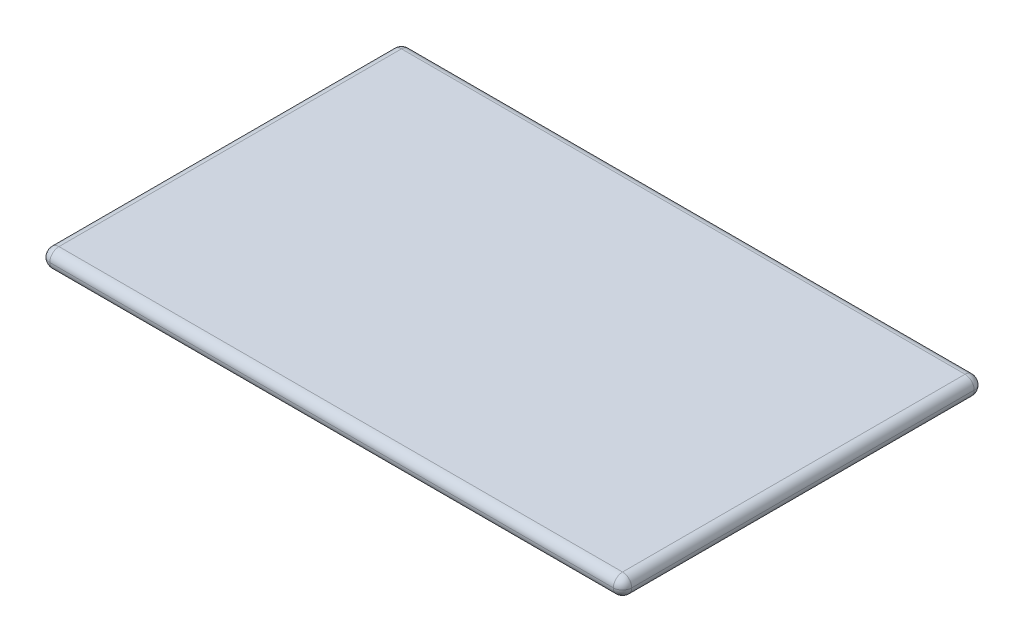
ISO-10303-21;
HEADER;
FILE_DESCRIPTION(('STEP AP214'),'2;1');
FILE_NAME('part.step','',(''),(''),'','','');
FILE_SCHEMA(('AUTOMOTIVE_DESIGN { 1 0 10303 214 1 1 1 1 }'));
ENDSEC;
DATA;
#1=APPLICATION_CONTEXT('core data for automotive mechanical design processes');
#2=APPLICATION_PROTOCOL_DEFINITION('international standard','automotive_design',2000,#1);
#3=PRODUCT_CONTEXT('',#1,'mechanical');
#4=PRODUCT('Part','Part','',(#3));
#5=PRODUCT_RELATED_PRODUCT_CATEGORY('part','',(#4));
#6=PRODUCT_DEFINITION_FORMATION('','',#4);
#7=PRODUCT_DEFINITION_CONTEXT('part definition',#1,'design');
#8=PRODUCT_DEFINITION('design','',#6,#7);
#9=PRODUCT_DEFINITION_SHAPE('','',#8);
#10=(LENGTH_UNIT() NAMED_UNIT(*) SI_UNIT(.MILLI.,.METRE.));
#11=(NAMED_UNIT(*) PLANE_ANGLE_UNIT() SI_UNIT($,.RADIAN.));
#12=(NAMED_UNIT(*) SI_UNIT($,.STERADIAN.) SOLID_ANGLE_UNIT());
#13=UNCERTAINTY_MEASURE_WITH_UNIT(LENGTH_MEASURE(1.E-05),#10,'distance_accuracy_value','');
#14=(GEOMETRIC_REPRESENTATION_CONTEXT(3) GLOBAL_UNCERTAINTY_ASSIGNED_CONTEXT((#13)) GLOBAL_UNIT_ASSIGNED_CONTEXT((#10,
#11,#12)) REPRESENTATION_CONTEXT('',''));
#15=CARTESIAN_POINT('',(0.,0.,0.));
#16=DIRECTION('',(0.,0.,1.));
#17=DIRECTION('',(1.,0.,0.));
#18=AXIS2_PLACEMENT_3D('',#15,#16,#17);
#19=CARTESIAN_POINT('',(0.,0.2032,4.0005));
#20=DIRECTION('',(0.,1.,0.));
#21=DIRECTION('',(-1.,0.,0.));
#22=AXIS2_PLACEMENT_3D('',#19,#20,#21);
#23=PLANE('',#22);
#24=DIRECTION('',(0.,0.,-1.));
#25=VECTOR('',#24,1.);
#26=CARTESIAN_POINT('',(6.2484,0.2032,4.0005));
#27=LINE('',#26,#25);
#28=CARTESIAN_POINT('',(6.2484,0.2032,3.7973));
#29=VERTEX_POINT('',#28);
#30=CARTESIAN_POINT('',(6.2484,0.2032,-3.7973));
#31=VERTEX_POINT('',#30);
#32=EDGE_CURVE('E45',#29,#31,#27,.T.);
#33=ORIENTED_EDGE('',*,*,#32,.T.);
#34=DIRECTION('',(1.,0.,0.));
#35=VECTOR('',#34,1.);
#36=CARTESIAN_POINT('',(-6.4516,0.2032,-3.7973));
#37=LINE('',#36,#35);
#38=CARTESIAN_POINT('',(-6.2484,0.2032,-3.7973));
#39=VERTEX_POINT('',#38);
#40=EDGE_CURVE('E11',#31,#39,#37,.F.);
#41=ORIENTED_EDGE('',*,*,#40,.T.);
#42=DIRECTION('',(0.,0.,-1.));
#43=VECTOR('',#42,1.);
#44=CARTESIAN_POINT('',(-6.2484,0.2032,4.0005));
#45=LINE('',#44,#43);
#46=CARTESIAN_POINT('',(-6.2484,0.2032,3.7973));
#47=VERTEX_POINT('',#46);
#48=EDGE_CURVE('E117',#39,#47,#45,.F.);
#49=ORIENTED_EDGE('',*,*,#48,.T.);
#50=DIRECTION('',(1.,0.,0.));
#51=VECTOR('',#50,1.);
#52=CARTESIAN_POINT('',(0.,0.2032,3.7973));
#53=LINE('',#52,#51);
#54=EDGE_CURVE('E115',#47,#29,#53,.T.);
#55=ORIENTED_EDGE('',*,*,#54,.T.);
#56=EDGE_LOOP('',(#33,#41,#49,#55));
#57=FACE_BOUND('',#56,.T.);
#58=ADVANCED_FACE('F35',(#57),#23,.T.);
#59=CARTESIAN_POINT('',(0.,-0.2032,4.0005));
#60=DIRECTION('',(0.,1.,0.));
#61=DIRECTION('',(0.,0.,1.));
#62=AXIS2_PLACEMENT_3D('',#59,#60,#61);
#63=PLANE('',#62);
#64=DIRECTION('',(0.,0.,-1.));
#65=VECTOR('',#64,1.);
#66=CARTESIAN_POINT('',(-6.2484,-0.2032,4.0005));
#67=LINE('',#66,#65);
#68=CARTESIAN_POINT('',(-6.2484,-0.2032,3.7973));
#69=VERTEX_POINT('',#68);
#70=CARTESIAN_POINT('',(-6.2484,-0.2032,-3.7973));
#71=VERTEX_POINT('',#70);
#72=EDGE_CURVE('E190',#69,#71,#67,.T.);
#73=ORIENTED_EDGE('',*,*,#72,.T.);
#74=DIRECTION('',(1.,0.,0.));
#75=VECTOR('',#74,1.);
#76=CARTESIAN_POINT('',(0.,-0.2032,-3.7973));
#77=LINE('',#76,#75);
#78=CARTESIAN_POINT('',(6.2484,-0.2032,-3.7973));
#79=VERTEX_POINT('',#78);
#80=EDGE_CURVE('E121',#71,#79,#77,.T.);
#81=ORIENTED_EDGE('',*,*,#80,.T.);
#82=DIRECTION('',(0.,0.,-1.));
#83=VECTOR('',#82,1.);
#84=CARTESIAN_POINT('',(6.2484,-0.2032,4.0005));
#85=LINE('',#84,#83);
#86=CARTESIAN_POINT('',(6.2484,-0.2032,3.7973));
#87=VERTEX_POINT('',#86);
#88=EDGE_CURVE('E196',#79,#87,#85,.F.);
#89=ORIENTED_EDGE('',*,*,#88,.T.);
#90=DIRECTION('',(1.,0.,0.));
#91=VECTOR('',#90,1.);
#92=CARTESIAN_POINT('',(-6.4516,-0.2032,3.7973));
#93=LINE('',#92,#91);
#94=EDGE_CURVE('E187',#87,#69,#93,.F.);
#95=ORIENTED_EDGE('',*,*,#94,.T.);
#96=EDGE_LOOP('',(#73,#81,#89,#95));
#97=FACE_BOUND('',#96,.T.);
#98=ADVANCED_FACE('F202',(#97),#63,.F.);
#99=CARTESIAN_POINT('',(-6.2484,0.,4.0005));
#100=DIRECTION('',(0.,0.,1.));
#101=DIRECTION('',(1.,0.,0.));
#102=AXIS2_PLACEMENT_3D('',#99,#100,#101);
#103=CYLINDRICAL_SURFACE('',#102,0.2032);
#104=DIRECTION('',(0.,0.,-1.));
#105=VECTOR('',#104,1.);
#106=CARTESIAN_POINT('',(-6.4516,0.,-4.0005));
#107=LINE('',#106,#105);
#108=CARTESIAN_POINT('',(-6.4516,0.,3.7973));
#109=VERTEX_POINT('',#108);
#110=CARTESIAN_POINT('',(-6.4516,0.,-3.7973));
#111=VERTEX_POINT('',#110);
#112=EDGE_CURVE('E180',#109,#111,#107,.T.);
#113=ORIENTED_EDGE('',*,*,#112,.F.);
#114=CARTESIAN_POINT('',(-6.2484,0.,3.7973));
#115=DIRECTION('',(0.,0.,1.));
#116=DIRECTION('',(1.,0.,0.));
#117=AXIS2_PLACEMENT_3D('',#114,#115,#116);
#118=CIRCLE('',#117,0.2032);
#119=EDGE_CURVE('E39',#47,#109,#118,.T.);
#120=ORIENTED_EDGE('',*,*,#119,.F.);
#121=ORIENTED_EDGE('',*,*,#48,.F.);
#122=CARTESIAN_POINT('',(-6.2484,0.,-3.7973));
#123=DIRECTION('',(0.,0.,-1.));
#124=DIRECTION('',(0.,1.,0.));
#125=AXIS2_PLACEMENT_3D('',#122,#123,#124);
#126=CIRCLE('',#125,0.2032);
#127=EDGE_CURVE('E82',#111,#39,#126,.T.);
#128=ORIENTED_EDGE('',*,*,#127,.F.);
#129=EDGE_LOOP('',(#113,#120,#121,#128));
#130=FACE_BOUND('',#129,.T.);
#131=ADVANCED_FACE('F37',(#130),#103,.T.);
#132=CARTESIAN_POINT('',(-6.2484,0.,3.7973));
#133=DIRECTION('',(0.,0.,1.));
#134=DIRECTION('',(1.,0.,0.));
#135=AXIS2_PLACEMENT_3D('',#132,#133,#134);
#136=SPHERICAL_SURFACE('',#135,0.2032);
#137=ORIENTED_EDGE('',*,*,#119,.T.);
#138=CARTESIAN_POINT('',(-6.2484,0.,3.7973));
#139=DIRECTION('',(0.,-1.,0.));
#140=DIRECTION('',(0.,0.,-1.));
#141=AXIS2_PLACEMENT_3D('',#138,#139,#140);
#142=CIRCLE('',#141,0.2032);
#143=CARTESIAN_POINT('',(-6.2484,0.,4.0005));
#144=VERTEX_POINT('',#143);
#145=EDGE_CURVE('E89',#144,#109,#142,.T.);
#146=ORIENTED_EDGE('',*,*,#145,.F.);
#147=CARTESIAN_POINT('',(-6.2484,0.,3.7973));
#148=DIRECTION('',(-1.,0.,0.));
#149=DIRECTION('',(0.,0.,1.));
#150=AXIS2_PLACEMENT_3D('',#147,#148,#149);
#151=CIRCLE('',#150,0.2032);
#152=EDGE_CURVE('E175',#47,#144,#151,.F.);
#153=ORIENTED_EDGE('',*,*,#152,.F.);
#154=EDGE_LOOP('',(#137,#146,#153));
#155=FACE_BOUND('',#154,.T.);
#156=ADVANCED_FACE('F217',(#155),#136,.T.);
#157=CARTESIAN_POINT('',(-6.2484,0.,-3.7973));
#158=DIRECTION('',(0.,0.,1.));
#159=DIRECTION('',(1.,0.,0.));
#160=AXIS2_PLACEMENT_3D('',#157,#158,#159);
#161=SPHERICAL_SURFACE('',#160,0.2032);
#162=CARTESIAN_POINT('',(-6.2484,0.,-3.7973));
#163=DIRECTION('',(0.,1.,0.));
#164=DIRECTION('',(0.,0.,1.));
#165=AXIS2_PLACEMENT_3D('',#162,#163,#164);
#166=CIRCLE('',#165,0.2032);
#167=CARTESIAN_POINT('',(-6.2484,0.,-4.0005));
#168=VERTEX_POINT('',#167);
#169=EDGE_CURVE('E183',#111,#168,#166,.F.);
#170=ORIENTED_EDGE('',*,*,#169,.F.);
#171=ORIENTED_EDGE('',*,*,#127,.T.);
#172=CARTESIAN_POINT('',(-6.2484,0.,-3.7973));
#173=DIRECTION('',(-1.,0.,0.));
#174=DIRECTION('',(0.,0.,1.));
#175=AXIS2_PLACEMENT_3D('',#172,#173,#174);
#176=CIRCLE('',#175,0.2032);
#177=EDGE_CURVE('E172',#168,#39,#176,.F.);
#178=ORIENTED_EDGE('',*,*,#177,.F.);
#179=EDGE_LOOP('',(#170,#171,#178));
#180=FACE_BOUND('',#179,.T.);
#181=ADVANCED_FACE('F327',(#180),#161,.T.);
#182=CARTESIAN_POINT('',(-6.2484,0.,4.0005));
#183=DIRECTION('',(0.,0.,-1.));
#184=DIRECTION('',(-1.,0.,0.));
#185=AXIS2_PLACEMENT_3D('',#182,#183,#184);
#186=CYLINDRICAL_SURFACE('',#185,0.2032);
#187=CARTESIAN_POINT('',(-6.2484,0.,3.7973));
#188=DIRECTION('',(0.,0.,1.));
#189=DIRECTION('',(1.,0.,0.));
#190=AXIS2_PLACEMENT_3D('',#187,#188,#189);
#191=CIRCLE('',#190,0.2032);
#192=EDGE_CURVE('E178',#109,#69,#191,.T.);
#193=ORIENTED_EDGE('',*,*,#192,.F.);
#194=ORIENTED_EDGE('',*,*,#112,.T.);
#195=CARTESIAN_POINT('',(-6.2484,0.,-3.7973));
#196=DIRECTION('',(0.,0.,-1.));
#197=DIRECTION('',(-1.,0.,0.));
#198=AXIS2_PLACEMENT_3D('',#195,#196,#197);
#199=CIRCLE('',#198,0.2032);
#200=EDGE_CURVE('E169',#71,#111,#199,.T.);
#201=ORIENTED_EDGE('',*,*,#200,.F.);
#202=ORIENTED_EDGE('',*,*,#72,.F.);
#203=EDGE_LOOP('',(#193,#194,#201,#202));
#204=FACE_BOUND('',#203,.T.);
#205=ADVANCED_FACE('F319',(#204),#186,.T.);
#206=CARTESIAN_POINT('',(-6.2484,0.,3.7973));
#207=DIRECTION('',(0.,0.,1.));
#208=DIRECTION('',(1.,0.,0.));
#209=AXIS2_PLACEMENT_3D('',#206,#207,#208);
#210=SPHERICAL_SURFACE('',#209,0.2032);
#211=ORIENTED_EDGE('',*,*,#145,.T.);
#212=ORIENTED_EDGE('',*,*,#192,.T.);
#213=CARTESIAN_POINT('',(-6.2484,0.,3.7973));
#214=DIRECTION('',(-1.,0.,0.));
#215=DIRECTION('',(0.,0.,1.));
#216=AXIS2_PLACEMENT_3D('',#213,#214,#215);
#217=CIRCLE('',#216,0.2032);
#218=EDGE_CURVE('E166',#144,#69,#217,.F.);
#219=ORIENTED_EDGE('',*,*,#218,.F.);
#220=EDGE_LOOP('',(#211,#212,#219));
#221=FACE_BOUND('',#220,.T.);
#222=ADVANCED_FACE('F218',(#221),#210,.T.);
#223=CARTESIAN_POINT('',(0.,0.,3.7973));
#224=DIRECTION('',(1.,0.,0.));
#225=DIRECTION('',(0.,1.,0.));
#226=AXIS2_PLACEMENT_3D('',#223,#224,#225);
#227=CYLINDRICAL_SURFACE('',#226,0.2032);
#228=ORIENTED_EDGE('',*,*,#54,.F.);
#229=ORIENTED_EDGE('',*,*,#152,.T.);
#230=DIRECTION('',(1.,0.,0.));
#231=VECTOR('',#230,1.);
#232=CARTESIAN_POINT('',(0.,0.,4.0005));
#233=LINE('',#232,#231);
#234=CARTESIAN_POINT('',(6.2484,0.,4.0005));
#235=VERTEX_POINT('',#234);
#236=EDGE_CURVE('E128',#235,#144,#233,.F.);
#237=ORIENTED_EDGE('',*,*,#236,.F.);
#238=CARTESIAN_POINT('',(6.2484,0.,3.7973));
#239=DIRECTION('',(1.,0.,0.));
#240=DIRECTION('',(0.,0.,-1.));
#241=AXIS2_PLACEMENT_3D('',#238,#239,#240);
#242=CIRCLE('',#241,0.2032);
#243=EDGE_CURVE('E124',#29,#235,#242,.T.);
#244=ORIENTED_EDGE('',*,*,#243,.F.);
#245=EDGE_LOOP('',(#228,#229,#237,#244));
#246=FACE_BOUND('',#245,.T.);
#247=ADVANCED_FACE('F126',(#246),#227,.T.);
#248=CARTESIAN_POINT('',(0.,0.,-3.7973));
#249=DIRECTION('',(-1.,0.,0.));
#250=DIRECTION('',(0.,-1.,0.));
#251=AXIS2_PLACEMENT_3D('',#248,#249,#250);
#252=CYLINDRICAL_SURFACE('',#251,0.2032);
#253=ORIENTED_EDGE('',*,*,#177,.T.);
#254=ORIENTED_EDGE('',*,*,#40,.F.);
#255=CARTESIAN_POINT('',(6.2484,0.,-3.7973));
#256=DIRECTION('',(1.,0.,0.));
#257=DIRECTION('',(0.,0.,-1.));
#258=AXIS2_PLACEMENT_3D('',#255,#256,#257);
#259=CIRCLE('',#258,0.2032);
#260=CARTESIAN_POINT('',(6.2484,0.,-4.0005));
#261=VERTEX_POINT('',#260);
#262=EDGE_CURVE('E131',#261,#31,#259,.T.);
#263=ORIENTED_EDGE('',*,*,#262,.F.);
#264=DIRECTION('',(1.,0.,0.));
#265=VECTOR('',#264,1.);
#266=CARTESIAN_POINT('',(6.4516,0.,-4.0005));
#267=LINE('',#266,#265);
#268=EDGE_CURVE('E158',#168,#261,#267,.T.);
#269=ORIENTED_EDGE('',*,*,#268,.F.);
#270=EDGE_LOOP('',(#253,#254,#263,#269));
#271=FACE_BOUND('',#270,.T.);
#272=ADVANCED_FACE('F216',(#271),#252,.T.);
#273=CARTESIAN_POINT('',(-6.2484,0.,-3.7973));
#274=DIRECTION('',(0.,0.,1.));
#275=DIRECTION('',(1.,0.,0.));
#276=AXIS2_PLACEMENT_3D('',#273,#274,#275);
#277=SPHERICAL_SURFACE('',#276,0.2032);
#278=ORIENTED_EDGE('',*,*,#200,.T.);
#279=ORIENTED_EDGE('',*,*,#169,.T.);
#280=CARTESIAN_POINT('',(-6.2484,0.,-3.7973));
#281=DIRECTION('',(-1.,0.,0.));
#282=DIRECTION('',(0.,0.,1.));
#283=AXIS2_PLACEMENT_3D('',#280,#281,#282);
#284=CIRCLE('',#283,0.2032);
#285=EDGE_CURVE('E155',#71,#168,#284,.F.);
#286=ORIENTED_EDGE('',*,*,#285,.F.);
#287=EDGE_LOOP('',(#278,#279,#286));
#288=FACE_BOUND('',#287,.T.);
#289=ADVANCED_FACE('F289',(#288),#277,.T.);
#290=CARTESIAN_POINT('',(0.,0.,3.7973));
#291=DIRECTION('',(-1.,0.,0.));
#292=DIRECTION('',(0.,0.,1.));
#293=AXIS2_PLACEMENT_3D('',#290,#291,#292);
#294=CYLINDRICAL_SURFACE('',#293,0.2032);
#295=CARTESIAN_POINT('',(6.2484,0.,3.7973));
#296=DIRECTION('',(1.,0.,0.));
#297=DIRECTION('',(0.,0.,-1.));
#298=AXIS2_PLACEMENT_3D('',#295,#296,#297);
#299=CIRCLE('',#298,0.2032);
#300=EDGE_CURVE('E153',#235,#87,#299,.T.);
#301=ORIENTED_EDGE('',*,*,#300,.F.);
#302=ORIENTED_EDGE('',*,*,#236,.T.);
#303=ORIENTED_EDGE('',*,*,#218,.T.);
#304=ORIENTED_EDGE('',*,*,#94,.F.);
#305=EDGE_LOOP('',(#301,#302,#303,#304));
#306=FACE_BOUND('',#305,.T.);
#307=ADVANCED_FACE('F221',(#306),#294,.T.);
#308=CARTESIAN_POINT('',(6.2484,0.,3.7973));
#309=DIRECTION('',(0.,0.,1.));
#310=DIRECTION('',(1.,0.,0.));
#311=AXIS2_PLACEMENT_3D('',#308,#309,#310);
#312=SPHERICAL_SURFACE('',#311,0.2032);
#313=ORIENTED_EDGE('',*,*,#243,.T.);
#314=CARTESIAN_POINT('',(6.2484,0.,3.7973));
#315=DIRECTION('',(0.,-1.,0.));
#316=DIRECTION('',(0.,0.,-1.));
#317=AXIS2_PLACEMENT_3D('',#314,#315,#316);
#318=CIRCLE('',#317,0.2032);
#319=CARTESIAN_POINT('',(6.4516,0.,3.7973));
#320=VERTEX_POINT('',#319);
#321=EDGE_CURVE('E136',#320,#235,#318,.T.);
#322=ORIENTED_EDGE('',*,*,#321,.F.);
#323=CARTESIAN_POINT('',(6.2484,0.,3.7973));
#324=DIRECTION('',(0.,0.,1.));
#325=DIRECTION('',(1.,0.,0.));
#326=AXIS2_PLACEMENT_3D('',#323,#324,#325);
#327=CIRCLE('',#326,0.2032);
#328=EDGE_CURVE('E134',#29,#320,#327,.F.);
#329=ORIENTED_EDGE('',*,*,#328,.F.);
#330=EDGE_LOOP('',(#313,#322,#329));
#331=FACE_BOUND('',#330,.T.);
#332=ADVANCED_FACE('F135',(#331),#312,.T.);
#333=CARTESIAN_POINT('',(6.2484,0.,-3.7973));
#334=DIRECTION('',(0.,0.,1.));
#335=DIRECTION('',(1.,0.,0.));
#336=AXIS2_PLACEMENT_3D('',#333,#334,#335);
#337=SPHERICAL_SURFACE('',#336,0.2032);
#338=CARTESIAN_POINT('',(6.2484,0.,-3.7973));
#339=DIRECTION('',(0.,1.,0.));
#340=DIRECTION('',(0.,0.,1.));
#341=AXIS2_PLACEMENT_3D('',#338,#339,#340);
#342=CIRCLE('',#341,0.2032);
#343=CARTESIAN_POINT('',(6.4516,0.,-3.7973));
#344=VERTEX_POINT('',#343);
#345=EDGE_CURVE('E161',#261,#344,#342,.F.);
#346=ORIENTED_EDGE('',*,*,#345,.F.);
#347=ORIENTED_EDGE('',*,*,#262,.T.);
#348=CARTESIAN_POINT('',(6.2484,0.,-3.7973));
#349=DIRECTION('',(0.,0.,-1.));
#350=DIRECTION('',(-1.,0.,0.));
#351=AXIS2_PLACEMENT_3D('',#348,#349,#350);
#352=CIRCLE('',#351,0.2032);
#353=EDGE_CURVE('E54',#344,#31,#352,.F.);
#354=ORIENTED_EDGE('',*,*,#353,.F.);
#355=EDGE_LOOP('',(#346,#347,#354));
#356=FACE_BOUND('',#355,.T.);
#357=ADVANCED_FACE('F213',(#356),#337,.T.);
#358=CARTESIAN_POINT('',(0.,0.,-3.7973));
#359=DIRECTION('',(1.,0.,0.));
#360=DIRECTION('',(0.,0.,-1.));
#361=AXIS2_PLACEMENT_3D('',#358,#359,#360);
#362=CYLINDRICAL_SURFACE('',#361,0.2032);
#363=ORIENTED_EDGE('',*,*,#285,.T.);
#364=ORIENTED_EDGE('',*,*,#268,.T.);
#365=CARTESIAN_POINT('',(6.2484,0.,-3.7973));
#366=DIRECTION('',(1.,0.,0.));
#367=DIRECTION('',(0.,0.,-1.));
#368=AXIS2_PLACEMENT_3D('',#365,#366,#367);
#369=CIRCLE('',#368,0.2032);
#370=EDGE_CURVE('E148',#79,#261,#369,.T.);
#371=ORIENTED_EDGE('',*,*,#370,.F.);
#372=ORIENTED_EDGE('',*,*,#80,.F.);
#373=EDGE_LOOP('',(#363,#364,#371,#372));
#374=FACE_BOUND('',#373,.T.);
#375=ADVANCED_FACE('F205',(#374),#362,.T.);
#376=CARTESIAN_POINT('',(6.2484,0.,3.7973));
#377=DIRECTION('',(0.,0.,1.));
#378=DIRECTION('',(1.,0.,0.));
#379=AXIS2_PLACEMENT_3D('',#376,#377,#378);
#380=SPHERICAL_SURFACE('',#379,0.2032);
#381=ORIENTED_EDGE('',*,*,#321,.T.);
#382=ORIENTED_EDGE('',*,*,#300,.T.);
#383=CARTESIAN_POINT('',(6.2484,0.,3.7973));
#384=DIRECTION('',(0.,0.,1.));
#385=DIRECTION('',(1.,0.,0.));
#386=AXIS2_PLACEMENT_3D('',#383,#384,#385);
#387=CIRCLE('',#386,0.2032);
#388=EDGE_CURVE('E98',#320,#87,#387,.F.);
#389=ORIENTED_EDGE('',*,*,#388,.F.);
#390=EDGE_LOOP('',(#381,#382,#389));
#391=FACE_BOUND('',#390,.T.);
#392=ADVANCED_FACE('F223',(#391),#380,.T.);
#393=CARTESIAN_POINT('',(6.2484,0.,4.0005));
#394=DIRECTION('',(0.,0.,-1.));
#395=DIRECTION('',(-1.,0.,0.));
#396=AXIS2_PLACEMENT_3D('',#393,#394,#395);
#397=CYLINDRICAL_SURFACE('',#396,0.2032);
#398=ORIENTED_EDGE('',*,*,#32,.F.);
#399=ORIENTED_EDGE('',*,*,#328,.T.);
#400=DIRECTION('',(0.,0.,-1.));
#401=VECTOR('',#400,1.);
#402=CARTESIAN_POINT('',(6.4516,0.,4.0005));
#403=LINE('',#402,#401);
#404=EDGE_CURVE('E145',#344,#320,#403,.F.);
#405=ORIENTED_EDGE('',*,*,#404,.F.);
#406=ORIENTED_EDGE('',*,*,#353,.T.);
#407=EDGE_LOOP('',(#398,#399,#405,#406));
#408=FACE_BOUND('',#407,.T.);
#409=ADVANCED_FACE('F138',(#408),#397,.T.);
#410=CARTESIAN_POINT('',(6.2484,0.,-3.7973));
#411=DIRECTION('',(0.,0.,1.));
#412=DIRECTION('',(1.,0.,0.));
#413=AXIS2_PLACEMENT_3D('',#410,#411,#412);
#414=SPHERICAL_SURFACE('',#413,0.2032);
#415=ORIENTED_EDGE('',*,*,#370,.T.);
#416=ORIENTED_EDGE('',*,*,#345,.T.);
#417=CARTESIAN_POINT('',(6.2484,0.,-3.7973));
#418=DIRECTION('',(0.,0.,-1.));
#419=DIRECTION('',(0.,1.,0.));
#420=AXIS2_PLACEMENT_3D('',#417,#418,#419);
#421=CIRCLE('',#420,0.2032);
#422=EDGE_CURVE('E142',#79,#344,#421,.F.);
#423=ORIENTED_EDGE('',*,*,#422,.F.);
#424=EDGE_LOOP('',(#415,#416,#423));
#425=FACE_BOUND('',#424,.T.);
#426=ADVANCED_FACE('F210',(#425),#414,.T.);
#427=CARTESIAN_POINT('',(6.2484,0.,4.0005));
#428=DIRECTION('',(0.,0.,1.));
#429=DIRECTION('',(1.,0.,0.));
#430=AXIS2_PLACEMENT_3D('',#427,#428,#429);
#431=CYLINDRICAL_SURFACE('',#430,0.2032);
#432=ORIENTED_EDGE('',*,*,#388,.T.);
#433=ORIENTED_EDGE('',*,*,#88,.F.);
#434=ORIENTED_EDGE('',*,*,#422,.T.);
#435=ORIENTED_EDGE('',*,*,#404,.T.);
#436=EDGE_LOOP('',(#432,#433,#434,#435));
#437=FACE_BOUND('',#436,.T.);
#438=ADVANCED_FACE('F209',(#437),#431,.T.);
#439=CLOSED_SHELL('',(#58,#98,#131,#156,#181,#205,#222,#247,#272,#289,#307,#332,#357,#375,#392,
#409,#426,#438));
#440=MANIFOLD_SOLID_BREP('B2',#439);
#441=ADVANCED_BREP_SHAPE_REPRESENTATION('',(#18,#440),#14);
#442=SHAPE_DEFINITION_REPRESENTATION(#9,#441);
ENDSEC;
END-ISO-10303-21;
